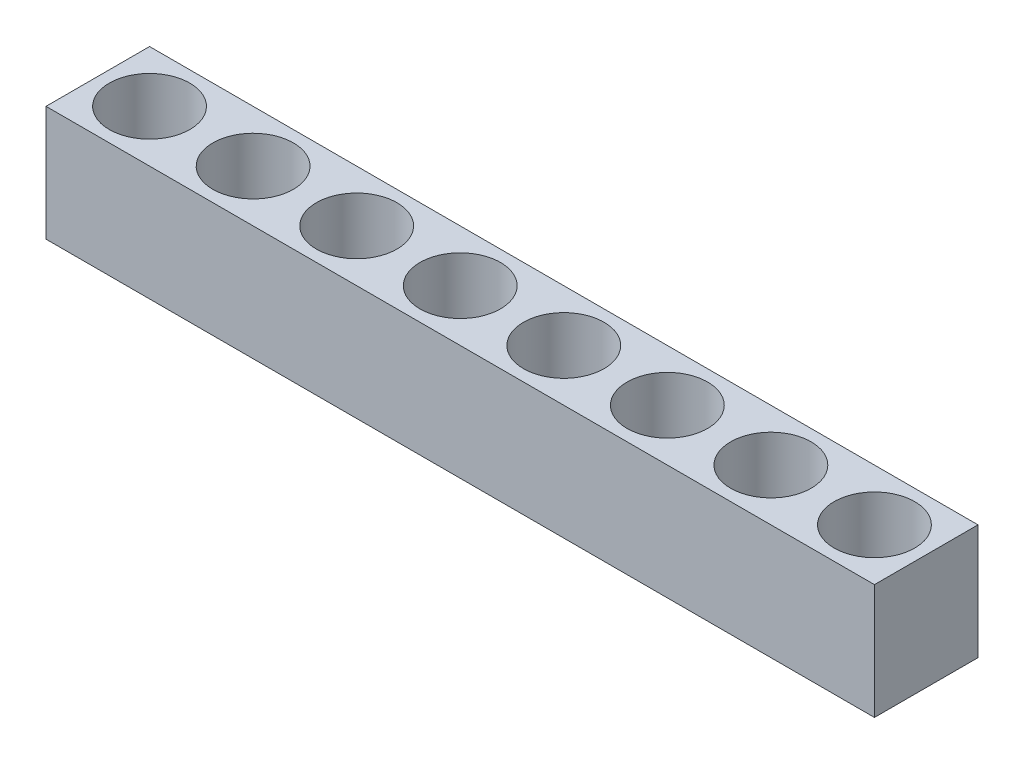
ISO-10303-21;
HEADER;
FILE_DESCRIPTION(('STEP AP214'),'2;1');
FILE_NAME('part.step','',(''),(''),'','','');
FILE_SCHEMA(('AUTOMOTIVE_DESIGN { 1 0 10303 214 1 1 1 1 }'));
ENDSEC;
DATA;
#1=APPLICATION_CONTEXT('core data for automotive mechanical design processes');
#2=APPLICATION_PROTOCOL_DEFINITION('international standard','automotive_design',2000,#1);
#3=PRODUCT_CONTEXT('',#1,'mechanical');
#4=PRODUCT('Part','Part','',(#3));
#5=PRODUCT_RELATED_PRODUCT_CATEGORY('part','',(#4));
#6=PRODUCT_DEFINITION_FORMATION('','',#4);
#7=PRODUCT_DEFINITION_CONTEXT('part definition',#1,'design');
#8=PRODUCT_DEFINITION('design','',#6,#7);
#9=PRODUCT_DEFINITION_SHAPE('','',#8);
#10=(LENGTH_UNIT() NAMED_UNIT(*) SI_UNIT(.MILLI.,.METRE.));
#11=(NAMED_UNIT(*) PLANE_ANGLE_UNIT() SI_UNIT($,.RADIAN.));
#12=(NAMED_UNIT(*) SI_UNIT($,.STERADIAN.) SOLID_ANGLE_UNIT());
#13=UNCERTAINTY_MEASURE_WITH_UNIT(LENGTH_MEASURE(1.E-05),#10,'distance_accuracy_value','');
#14=(GEOMETRIC_REPRESENTATION_CONTEXT(3) GLOBAL_UNCERTAINTY_ASSIGNED_CONTEXT((#13)) GLOBAL_UNIT_ASSIGNED_CONTEXT((#10,
#11,#12)) REPRESENTATION_CONTEXT('',''));
#15=CARTESIAN_POINT('',(0.,0.,0.));
#16=DIRECTION('',(0.,0.,1.));
#17=DIRECTION('',(1.,0.,0.));
#18=AXIS2_PLACEMENT_3D('',#15,#16,#17);
#19=CARTESIAN_POINT('',(36.,-10.,4.5));
#20=DIRECTION('',(1.,0.,0.));
#21=DIRECTION('',(0.,0.,-1.));
#22=AXIS2_PLACEMENT_3D('',#19,#20,#21);
#23=PLANE('',#22);
#24=DIRECTION('',(0.,0.,-1.));
#25=VECTOR('',#24,1.);
#26=CARTESIAN_POINT('',(36.,0.,4.5));
#27=LINE('',#26,#25);
#28=CARTESIAN_POINT('',(36.,0.,4.5));
#29=VERTEX_POINT('',#28);
#30=CARTESIAN_POINT('',(36.,0.,-4.5));
#31=VERTEX_POINT('',#30);
#32=EDGE_CURVE('E98',#29,#31,#27,.T.);
#33=ORIENTED_EDGE('',*,*,#32,.F.);
#34=DIRECTION('',(0.,1.,0.));
#35=VECTOR('',#34,1.);
#36=CARTESIAN_POINT('',(36.,-10.,4.5));
#37=LINE('',#36,#35);
#38=CARTESIAN_POINT('',(36.,-10.,4.5));
#39=VERTEX_POINT('',#38);
#40=EDGE_CURVE('E11',#39,#29,#37,.T.);
#41=ORIENTED_EDGE('',*,*,#40,.F.);
#42=DIRECTION('',(0.,0.,-1.));
#43=VECTOR('',#42,1.);
#44=CARTESIAN_POINT('',(36.,-10.,4.5));
#45=LINE('',#44,#43);
#46=CARTESIAN_POINT('',(36.,-10.,-4.5));
#47=VERTEX_POINT('',#46);
#48=EDGE_CURVE('E91',#39,#47,#45,.T.);
#49=ORIENTED_EDGE('',*,*,#48,.T.);
#50=DIRECTION('',(0.,1.,0.));
#51=VECTOR('',#50,1.);
#52=CARTESIAN_POINT('',(36.,-10.,-4.5));
#53=LINE('',#52,#51);
#54=EDGE_CURVE('E36',#47,#31,#53,.T.);
#55=ORIENTED_EDGE('',*,*,#54,.T.);
#56=EDGE_LOOP('',(#33,#41,#49,#55));
#57=FACE_BOUND('',#56,.T.);
#58=ADVANCED_FACE('F33',(#57),#23,.T.);
#59=CARTESIAN_POINT('',(36.,-10.,4.5));
#60=DIRECTION('',(0.,0.,1.));
#61=DIRECTION('',(1.,0.,0.));
#62=AXIS2_PLACEMENT_3D('',#59,#60,#61);
#63=PLANE('',#62);
#64=DIRECTION('',(1.,0.,0.));
#65=VECTOR('',#64,1.);
#66=CARTESIAN_POINT('',(36.,0.,4.5));
#67=LINE('',#66,#65);
#68=CARTESIAN_POINT('',(-36.,0.,4.5));
#69=VERTEX_POINT('',#68);
#70=EDGE_CURVE('E93',#69,#29,#67,.T.);
#71=ORIENTED_EDGE('',*,*,#70,.F.);
#72=DIRECTION('',(0.,1.,0.));
#73=VECTOR('',#72,1.);
#74=CARTESIAN_POINT('',(-36.,-10.,4.5));
#75=LINE('',#74,#73);
#76=CARTESIAN_POINT('',(-36.,-10.,4.5));
#77=VERTEX_POINT('',#76);
#78=EDGE_CURVE('E42',#77,#69,#75,.T.);
#79=ORIENTED_EDGE('',*,*,#78,.F.);
#80=DIRECTION('',(1.,0.,0.));
#81=VECTOR('',#80,1.);
#82=CARTESIAN_POINT('',(36.,-10.,4.5));
#83=LINE('',#82,#81);
#84=EDGE_CURVE('E88',#77,#39,#83,.T.);
#85=ORIENTED_EDGE('',*,*,#84,.T.);
#86=ORIENTED_EDGE('',*,*,#40,.T.);
#87=EDGE_LOOP('',(#71,#79,#85,#86));
#88=FACE_BOUND('',#87,.T.);
#89=ADVANCED_FACE('F109',(#88),#63,.T.);
#90=CARTESIAN_POINT('',(-36.,-10.,-4.5));
#91=DIRECTION('',(-1.,0.,0.));
#92=DIRECTION('',(0.,0.,1.));
#93=AXIS2_PLACEMENT_3D('',#90,#91,#92);
#94=PLANE('',#93);
#95=DIRECTION('',(0.,0.,1.));
#96=VECTOR('',#95,1.);
#97=CARTESIAN_POINT('',(-36.,0.,-4.5));
#98=LINE('',#97,#96);
#99=CARTESIAN_POINT('',(-36.,0.,-4.5));
#100=VERTEX_POINT('',#99);
#101=EDGE_CURVE('E83',#100,#69,#98,.T.);
#102=ORIENTED_EDGE('',*,*,#101,.F.);
#103=DIRECTION('',(0.,1.,0.));
#104=VECTOR('',#103,1.);
#105=CARTESIAN_POINT('',(-36.,-10.,-4.5));
#106=LINE('',#105,#104);
#107=CARTESIAN_POINT('',(-36.,-10.,-4.5));
#108=VERTEX_POINT('',#107);
#109=EDGE_CURVE('E78',#108,#100,#106,.T.);
#110=ORIENTED_EDGE('',*,*,#109,.F.);
#111=DIRECTION('',(0.,0.,1.));
#112=VECTOR('',#111,1.);
#113=CARTESIAN_POINT('',(-36.,-10.,-4.5));
#114=LINE('',#113,#112);
#115=EDGE_CURVE('E81',#108,#77,#114,.T.);
#116=ORIENTED_EDGE('',*,*,#115,.T.);
#117=ORIENTED_EDGE('',*,*,#78,.T.);
#118=EDGE_LOOP('',(#102,#110,#116,#117));
#119=FACE_BOUND('',#118,.T.);
#120=ADVANCED_FACE('F80',(#119),#94,.T.);
#121=CARTESIAN_POINT('',(-36.,-10.,-4.5));
#122=DIRECTION('',(0.,0.,-1.));
#123=DIRECTION('',(-1.,0.,0.));
#124=AXIS2_PLACEMENT_3D('',#121,#122,#123);
#125=PLANE('',#124);
#126=DIRECTION('',(-1.,0.,0.));
#127=VECTOR('',#126,1.);
#128=CARTESIAN_POINT('',(-36.,0.,-4.5));
#129=LINE('',#128,#127);
#130=EDGE_CURVE('E101',#31,#100,#129,.T.);
#131=ORIENTED_EDGE('',*,*,#130,.F.);
#132=ORIENTED_EDGE('',*,*,#54,.F.);
#133=DIRECTION('',(-1.,0.,0.));
#134=VECTOR('',#133,1.);
#135=CARTESIAN_POINT('',(-36.,-10.,-4.5));
#136=LINE('',#135,#134);
#137=EDGE_CURVE('E87',#47,#108,#136,.T.);
#138=ORIENTED_EDGE('',*,*,#137,.T.);
#139=ORIENTED_EDGE('',*,*,#109,.T.);
#140=EDGE_LOOP('',(#131,#132,#138,#139));
#141=FACE_BOUND('',#140,.T.);
#142=ADVANCED_FACE('F90',(#141),#125,.T.);
#143=CARTESIAN_POINT('',(36.,-10.,-4.5));
#144=DIRECTION('',(0.,-1.,0.));
#145=DIRECTION('',(0.,0.,-1.));
#146=AXIS2_PLACEMENT_3D('',#143,#144,#145);
#147=PLANE('',#146);
#148=CARTESIAN_POINT('',(-31.5,-10.,1.88539992297529E-13));
#149=DIRECTION('',(0.,1.,0.));
#150=DIRECTION('',(0.,0.,1.));
#151=AXIS2_PLACEMENT_3D('',#148,#149,#150);
#152=CIRCLE('',#151,3.5);
#153=CARTESIAN_POINT('',(-31.5,-10.,3.50000000000019));
#154=VERTEX_POINT('',#153);
#155=EDGE_CURVE('E166',#154,#154,#152,.T.);
#156=ORIENTED_EDGE('',*,*,#155,.T.);
#157=EDGE_LOOP('',(#156));
#158=FACE_BOUND('',#157,.T.);
#159=CARTESIAN_POINT('',(-22.5,-10.,1.25693328198353E-13));
#160=DIRECTION('',(0.,1.,0.));
#161=DIRECTION('',(0.,0.,1.));
#162=AXIS2_PLACEMENT_3D('',#159,#160,#161);
#163=CIRCLE('',#162,3.5);
#164=CARTESIAN_POINT('',(-22.5,-10.,3.50000000000013));
#165=VERTEX_POINT('',#164);
#166=EDGE_CURVE('E174',#165,#165,#163,.T.);
#167=ORIENTED_EDGE('',*,*,#166,.T.);
#168=EDGE_LOOP('',(#167));
#169=FACE_BOUND('',#168,.T.);
#170=CARTESIAN_POINT('',(-13.5,-10.,0.));
#171=DIRECTION('',(0.,1.,0.));
#172=DIRECTION('',(0.,0.,1.));
#173=AXIS2_PLACEMENT_3D('',#170,#171,#172);
#174=CIRCLE('',#173,3.5);
#175=CARTESIAN_POINT('',(-13.5,-10.,3.50000000000006));
#176=VERTEX_POINT('',#175);
#177=EDGE_CURVE('E180',#176,#176,#174,.T.);
#178=ORIENTED_EDGE('',*,*,#177,.T.);
#179=EDGE_LOOP('',(#178));
#180=FACE_BOUND('',#179,.T.);
#181=CARTESIAN_POINT('',(31.5,-10.,0.));
#182=DIRECTION('',(0.,1.,0.));
#183=DIRECTION('',(0.,0.,1.));
#184=AXIS2_PLACEMENT_3D('',#181,#182,#183);
#185=CIRCLE('',#184,3.5);
#186=CARTESIAN_POINT('',(31.5,-10.,3.5));
#187=VERTEX_POINT('',#186);
#188=EDGE_CURVE('E186',#187,#187,#185,.T.);
#189=ORIENTED_EDGE('',*,*,#188,.T.);
#190=EDGE_LOOP('',(#189));
#191=FACE_BOUND('',#190,.T.);
#192=CARTESIAN_POINT('',(22.5,-10.,0.));
#193=DIRECTION('',(0.,1.,0.));
#194=DIRECTION('',(0.,0.,1.));
#195=AXIS2_PLACEMENT_3D('',#192,#193,#194);
#196=CIRCLE('',#195,3.5);
#197=CARTESIAN_POINT('',(22.5,-10.,3.5));
#198=VERTEX_POINT('',#197);
#199=EDGE_CURVE('E192',#198,#198,#196,.T.);
#200=ORIENTED_EDGE('',*,*,#199,.T.);
#201=EDGE_LOOP('',(#200));
#202=FACE_BOUND('',#201,.T.);
#203=CARTESIAN_POINT('',(13.5,-10.,0.));
#204=DIRECTION('',(0.,1.,0.));
#205=DIRECTION('',(0.,0.,1.));
#206=AXIS2_PLACEMENT_3D('',#203,#204,#205);
#207=CIRCLE('',#206,3.5);
#208=CARTESIAN_POINT('',(13.5,-10.,3.5));
#209=VERTEX_POINT('',#208);
#210=EDGE_CURVE('E198',#209,#209,#207,.T.);
#211=ORIENTED_EDGE('',*,*,#210,.T.);
#212=EDGE_LOOP('',(#211));
#213=FACE_BOUND('',#212,.T.);
#214=CARTESIAN_POINT('',(4.5,-10.,0.));
#215=DIRECTION('',(0.,1.,0.));
#216=DIRECTION('',(0.,0.,1.));
#217=AXIS2_PLACEMENT_3D('',#214,#215,#216);
#218=CIRCLE('',#217,3.5);
#219=CARTESIAN_POINT('',(4.5,-10.,3.5));
#220=VERTEX_POINT('',#219);
#221=EDGE_CURVE('E204',#220,#220,#218,.T.);
#222=ORIENTED_EDGE('',*,*,#221,.T.);
#223=EDGE_LOOP('',(#222));
#224=FACE_BOUND('',#223,.T.);
#225=CARTESIAN_POINT('',(-4.5,-10.,0.));
#226=DIRECTION('',(0.,1.,0.));
#227=DIRECTION('',(0.,0.,1.));
#228=AXIS2_PLACEMENT_3D('',#225,#226,#227);
#229=CIRCLE('',#228,3.5);
#230=CARTESIAN_POINT('',(-4.5,-10.,3.5));
#231=VERTEX_POINT('',#230);
#232=EDGE_CURVE('E102',#231,#231,#229,.T.);
#233=ORIENTED_EDGE('',*,*,#232,.T.);
#234=EDGE_LOOP('',(#233));
#235=FACE_BOUND('',#234,.T.);
#236=ORIENTED_EDGE('',*,*,#48,.F.);
#237=ORIENTED_EDGE('',*,*,#84,.F.);
#238=ORIENTED_EDGE('',*,*,#115,.F.);
#239=ORIENTED_EDGE('',*,*,#137,.F.);
#240=EDGE_LOOP('',(#236,#237,#238,#239));
#241=FACE_BOUND('',#240,.T.);
#242=ADVANCED_FACE('F86',(#158,#169,#180,#191,#202,#213,#224,#235,#241),#147,.T.);
#243=CARTESIAN_POINT('',(36.,0.,-4.5));
#244=DIRECTION('',(0.,-1.,0.));
#245=DIRECTION('',(0.,0.,-1.));
#246=AXIS2_PLACEMENT_3D('',#243,#244,#245);
#247=PLANE('',#246);
#248=CARTESIAN_POINT('',(-31.5,0.,1.88539992297529E-13));
#249=DIRECTION('',(0.,1.,0.));
#250=DIRECTION('',(0.,0.,1.));
#251=AXIS2_PLACEMENT_3D('',#248,#249,#250);
#252=CIRCLE('',#251,3.5);
#253=CARTESIAN_POINT('',(-31.5,0.,3.50000000000019));
#254=VERTEX_POINT('',#253);
#255=EDGE_CURVE('E169',#254,#254,#252,.T.);
#256=ORIENTED_EDGE('',*,*,#255,.F.);
#257=EDGE_LOOP('',(#256));
#258=FACE_BOUND('',#257,.T.);
#259=CARTESIAN_POINT('',(-22.5,0.,1.25693328198353E-13));
#260=DIRECTION('',(0.,1.,0.));
#261=DIRECTION('',(0.,0.,1.));
#262=AXIS2_PLACEMENT_3D('',#259,#260,#261);
#263=CIRCLE('',#262,3.5);
#264=CARTESIAN_POINT('',(-22.5,0.,3.50000000000013));
#265=VERTEX_POINT('',#264);
#266=EDGE_CURVE('E171',#265,#265,#263,.T.);
#267=ORIENTED_EDGE('',*,*,#266,.F.);
#268=EDGE_LOOP('',(#267));
#269=FACE_BOUND('',#268,.T.);
#270=CARTESIAN_POINT('',(-13.5,0.,0.));
#271=DIRECTION('',(0.,1.,0.));
#272=DIRECTION('',(0.,0.,1.));
#273=AXIS2_PLACEMENT_3D('',#270,#271,#272);
#274=CIRCLE('',#273,3.5);
#275=CARTESIAN_POINT('',(-13.5,0.,3.50000000000006));
#276=VERTEX_POINT('',#275);
#277=EDGE_CURVE('E177',#276,#276,#274,.T.);
#278=ORIENTED_EDGE('',*,*,#277,.F.);
#279=EDGE_LOOP('',(#278));
#280=FACE_BOUND('',#279,.T.);
#281=CARTESIAN_POINT('',(31.5,0.,0.));
#282=DIRECTION('',(0.,1.,0.));
#283=DIRECTION('',(0.,0.,1.));
#284=AXIS2_PLACEMENT_3D('',#281,#282,#283);
#285=CIRCLE('',#284,3.5);
#286=CARTESIAN_POINT('',(31.5,0.,3.5));
#287=VERTEX_POINT('',#286);
#288=EDGE_CURVE('E183',#287,#287,#285,.T.);
#289=ORIENTED_EDGE('',*,*,#288,.F.);
#290=EDGE_LOOP('',(#289));
#291=FACE_BOUND('',#290,.T.);
#292=CARTESIAN_POINT('',(22.5,0.,0.));
#293=DIRECTION('',(0.,1.,0.));
#294=DIRECTION('',(0.,0.,1.));
#295=AXIS2_PLACEMENT_3D('',#292,#293,#294);
#296=CIRCLE('',#295,3.5);
#297=CARTESIAN_POINT('',(22.5,0.,3.5));
#298=VERTEX_POINT('',#297);
#299=EDGE_CURVE('E189',#298,#298,#296,.T.);
#300=ORIENTED_EDGE('',*,*,#299,.F.);
#301=EDGE_LOOP('',(#300));
#302=FACE_BOUND('',#301,.T.);
#303=CARTESIAN_POINT('',(13.5,0.,0.));
#304=DIRECTION('',(0.,1.,0.));
#305=DIRECTION('',(0.,0.,1.));
#306=AXIS2_PLACEMENT_3D('',#303,#304,#305);
#307=CIRCLE('',#306,3.5);
#308=CARTESIAN_POINT('',(13.5,0.,3.5));
#309=VERTEX_POINT('',#308);
#310=EDGE_CURVE('E195',#309,#309,#307,.T.);
#311=ORIENTED_EDGE('',*,*,#310,.F.);
#312=EDGE_LOOP('',(#311));
#313=FACE_BOUND('',#312,.T.);
#314=CARTESIAN_POINT('',(4.5,0.,0.));
#315=DIRECTION('',(0.,1.,0.));
#316=DIRECTION('',(0.,0.,1.));
#317=AXIS2_PLACEMENT_3D('',#314,#315,#316);
#318=CIRCLE('',#317,3.5);
#319=CARTESIAN_POINT('',(4.5,0.,3.5));
#320=VERTEX_POINT('',#319);
#321=EDGE_CURVE('E201',#320,#320,#318,.T.);
#322=ORIENTED_EDGE('',*,*,#321,.F.);
#323=EDGE_LOOP('',(#322));
#324=FACE_BOUND('',#323,.T.);
#325=CARTESIAN_POINT('',(-4.5,0.,0.));
#326=DIRECTION('',(0.,1.,0.));
#327=DIRECTION('',(0.,0.,1.));
#328=AXIS2_PLACEMENT_3D('',#325,#326,#327);
#329=CIRCLE('',#328,3.5);
#330=CARTESIAN_POINT('',(-4.5,0.,3.5));
#331=VERTEX_POINT('',#330);
#332=EDGE_CURVE('E207',#331,#331,#329,.T.);
#333=ORIENTED_EDGE('',*,*,#332,.F.);
#334=EDGE_LOOP('',(#333));
#335=FACE_BOUND('',#334,.T.);
#336=ORIENTED_EDGE('',*,*,#32,.T.);
#337=ORIENTED_EDGE('',*,*,#130,.T.);
#338=ORIENTED_EDGE('',*,*,#101,.T.);
#339=ORIENTED_EDGE('',*,*,#70,.T.);
#340=EDGE_LOOP('',(#336,#337,#338,#339));
#341=FACE_BOUND('',#340,.T.);
#342=ADVANCED_FACE('F108',(#258,#269,#280,#291,#302,#313,#324,#335,#341),#247,.F.);
#343=CARTESIAN_POINT('',(-4.5,-10.,0.));
#344=DIRECTION('',(0.,1.,0.));
#345=DIRECTION('',(0.,0.,1.));
#346=AXIS2_PLACEMENT_3D('',#343,#344,#345);
#347=CYLINDRICAL_SURFACE('',#346,3.5);
#348=ORIENTED_EDGE('',*,*,#232,.F.);
#349=EDGE_LOOP('',(#348));
#350=FACE_BOUND('',#349,.T.);
#351=ORIENTED_EDGE('',*,*,#332,.T.);
#352=EDGE_LOOP('',(#351));
#353=FACE_BOUND('',#352,.T.);
#354=ADVANCED_FACE('F127',(#350,#353),#347,.F.);
#355=CARTESIAN_POINT('',(4.5,-10.,0.));
#356=DIRECTION('',(0.,1.,0.));
#357=DIRECTION('',(0.,0.,1.));
#358=AXIS2_PLACEMENT_3D('',#355,#356,#357);
#359=CYLINDRICAL_SURFACE('',#358,3.5);
#360=ORIENTED_EDGE('',*,*,#221,.F.);
#361=EDGE_LOOP('',(#360));
#362=FACE_BOUND('',#361,.T.);
#363=ORIENTED_EDGE('',*,*,#321,.T.);
#364=EDGE_LOOP('',(#363));
#365=FACE_BOUND('',#364,.T.);
#366=ADVANCED_FACE('F134',(#362,#365),#359,.F.);
#367=CARTESIAN_POINT('',(13.5,-10.,0.));
#368=DIRECTION('',(0.,1.,0.));
#369=DIRECTION('',(0.,0.,1.));
#370=AXIS2_PLACEMENT_3D('',#367,#368,#369);
#371=CYLINDRICAL_SURFACE('',#370,3.5);
#372=ORIENTED_EDGE('',*,*,#210,.F.);
#373=EDGE_LOOP('',(#372));
#374=FACE_BOUND('',#373,.T.);
#375=ORIENTED_EDGE('',*,*,#310,.T.);
#376=EDGE_LOOP('',(#375));
#377=FACE_BOUND('',#376,.T.);
#378=ADVANCED_FACE('F138',(#374,#377),#371,.F.);
#379=CARTESIAN_POINT('',(22.5,-10.,0.));
#380=DIRECTION('',(0.,1.,0.));
#381=DIRECTION('',(0.,0.,1.));
#382=AXIS2_PLACEMENT_3D('',#379,#380,#381);
#383=CYLINDRICAL_SURFACE('',#382,3.5);
#384=ORIENTED_EDGE('',*,*,#199,.F.);
#385=EDGE_LOOP('',(#384));
#386=FACE_BOUND('',#385,.T.);
#387=ORIENTED_EDGE('',*,*,#299,.T.);
#388=EDGE_LOOP('',(#387));
#389=FACE_BOUND('',#388,.T.);
#390=ADVANCED_FACE('F142',(#386,#389),#383,.F.);
#391=CARTESIAN_POINT('',(31.5,-10.,0.));
#392=DIRECTION('',(0.,1.,0.));
#393=DIRECTION('',(0.,0.,1.));
#394=AXIS2_PLACEMENT_3D('',#391,#392,#393);
#395=CYLINDRICAL_SURFACE('',#394,3.5);
#396=ORIENTED_EDGE('',*,*,#188,.F.);
#397=EDGE_LOOP('',(#396));
#398=FACE_BOUND('',#397,.T.);
#399=ORIENTED_EDGE('',*,*,#288,.T.);
#400=EDGE_LOOP('',(#399));
#401=FACE_BOUND('',#400,.T.);
#402=ADVANCED_FACE('F146',(#398,#401),#395,.F.);
#403=CARTESIAN_POINT('',(-13.5,-10.,0.));
#404=DIRECTION('',(0.,1.,0.));
#405=DIRECTION('',(0.,0.,1.));
#406=AXIS2_PLACEMENT_3D('',#403,#404,#405);
#407=CYLINDRICAL_SURFACE('',#406,3.5);
#408=ORIENTED_EDGE('',*,*,#177,.F.);
#409=EDGE_LOOP('',(#408));
#410=FACE_BOUND('',#409,.T.);
#411=ORIENTED_EDGE('',*,*,#277,.T.);
#412=EDGE_LOOP('',(#411));
#413=FACE_BOUND('',#412,.T.);
#414=ADVANCED_FACE('F150',(#410,#413),#407,.F.);
#415=CARTESIAN_POINT('',(-22.5,-10.,1.25693328198353E-13));
#416=DIRECTION('',(0.,1.,0.));
#417=DIRECTION('',(0.,0.,1.));
#418=AXIS2_PLACEMENT_3D('',#415,#416,#417);
#419=CYLINDRICAL_SURFACE('',#418,3.5);
#420=ORIENTED_EDGE('',*,*,#166,.F.);
#421=EDGE_LOOP('',(#420));
#422=FACE_BOUND('',#421,.T.);
#423=ORIENTED_EDGE('',*,*,#266,.T.);
#424=EDGE_LOOP('',(#423));
#425=FACE_BOUND('',#424,.T.);
#426=ADVANCED_FACE('F154',(#422,#425),#419,.F.);
#427=CARTESIAN_POINT('',(-31.5,-10.,1.88539992297529E-13));
#428=DIRECTION('',(0.,1.,0.));
#429=DIRECTION('',(0.,0.,1.));
#430=AXIS2_PLACEMENT_3D('',#427,#428,#429);
#431=CYLINDRICAL_SURFACE('',#430,3.5);
#432=ORIENTED_EDGE('',*,*,#155,.F.);
#433=EDGE_LOOP('',(#432));
#434=FACE_BOUND('',#433,.T.);
#435=ORIENTED_EDGE('',*,*,#255,.T.);
#436=EDGE_LOOP('',(#435));
#437=FACE_BOUND('',#436,.T.);
#438=ADVANCED_FACE('F158',(#434,#437),#431,.F.);
#439=CLOSED_SHELL('',(#58,#89,#120,#142,#242,#342,#354,#366,#378,#390,#402,#414,#426,#438));
#440=MANIFOLD_SOLID_BREP('B2',#439);
#441=ADVANCED_BREP_SHAPE_REPRESENTATION('',(#18,#440),#14);
#442=SHAPE_DEFINITION_REPRESENTATION(#9,#441);
ENDSEC;
END-ISO-10303-21;
